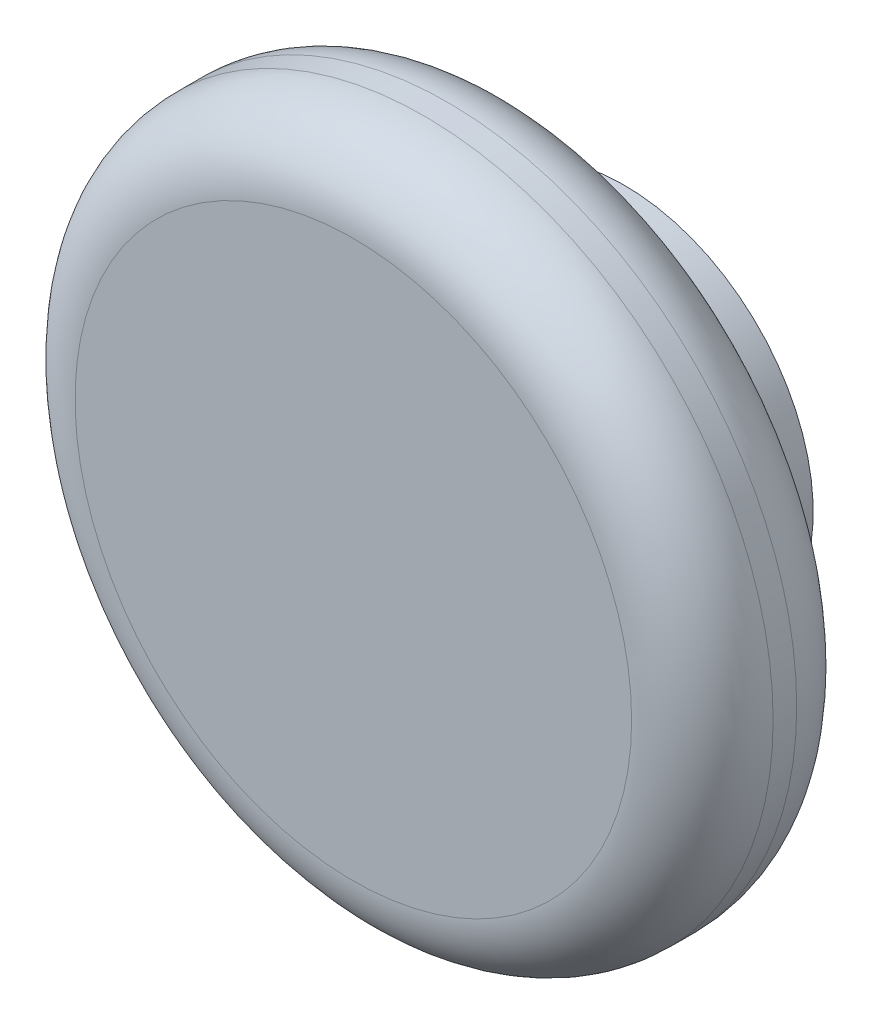
ISO-10303-21;
HEADER;
FILE_DESCRIPTION(('STEP AP214'),'2;1');
FILE_NAME('part.step','',(''),(''),'','','');
FILE_SCHEMA(('AUTOMOTIVE_DESIGN { 1 0 10303 214 1 1 1 1 }'));
ENDSEC;
DATA;
#1=APPLICATION_CONTEXT('core data for automotive mechanical design processes');
#2=APPLICATION_PROTOCOL_DEFINITION('international standard','automotive_design',2000,#1);
#3=PRODUCT_CONTEXT('',#1,'mechanical');
#4=PRODUCT('Part','Part','',(#3));
#5=PRODUCT_RELATED_PRODUCT_CATEGORY('part','',(#4));
#6=PRODUCT_DEFINITION_FORMATION('','',#4);
#7=PRODUCT_DEFINITION_CONTEXT('part definition',#1,'design');
#8=PRODUCT_DEFINITION('design','',#6,#7);
#9=PRODUCT_DEFINITION_SHAPE('','',#8);
#10=(LENGTH_UNIT() NAMED_UNIT(*) SI_UNIT(.MILLI.,.METRE.));
#11=(NAMED_UNIT(*) PLANE_ANGLE_UNIT() SI_UNIT($,.RADIAN.));
#12=(NAMED_UNIT(*) SI_UNIT($,.STERADIAN.) SOLID_ANGLE_UNIT());
#13=UNCERTAINTY_MEASURE_WITH_UNIT(LENGTH_MEASURE(1.E-05),#10,'distance_accuracy_value','');
#14=(GEOMETRIC_REPRESENTATION_CONTEXT(3) GLOBAL_UNCERTAINTY_ASSIGNED_CONTEXT((#13)) GLOBAL_UNIT_ASSIGNED_CONTEXT((#10,
#11,#12)) REPRESENTATION_CONTEXT('',''));
#15=CARTESIAN_POINT('',(0.,0.,0.));
#16=DIRECTION('',(0.,0.,1.));
#17=DIRECTION('',(1.,0.,0.));
#18=AXIS2_PLACEMENT_3D('',#15,#16,#17);
#19=CARTESIAN_POINT('',(-48.8951867843861,18.7018456364242,3.5));
#20=DIRECTION('',(0.,0.,-1.));
#21=DIRECTION('',(-1.,0.,0.));
#22=AXIS2_PLACEMENT_3D('',#19,#20,#21);
#23=CYLINDRICAL_SURFACE('',#22,7.4);
#24=CARTESIAN_POINT('',(-48.8951867843861,18.7018456364242,1.5));
#25=DIRECTION('',(0.,0.,1.));
#26=DIRECTION('',(1.,0.,0.));
#27=AXIS2_PLACEMENT_3D('',#24,#25,#26);
#28=CIRCLE('',#27,7.4);
#29=CARTESIAN_POINT('',(-41.4951867843861,18.7018456364242,1.5));
#30=VERTEX_POINT('',#29);
#31=EDGE_CURVE('E45',#30,#30,#28,.T.);
#32=ORIENTED_EDGE('',*,*,#31,.T.);
#33=EDGE_LOOP('',(#32));
#34=FACE_BOUND('',#33,.T.);
#35=CARTESIAN_POINT('',(-48.8951867843861,18.7018456364242,2.));
#36=DIRECTION('',(0.,0.,1.));
#37=DIRECTION('',(1.,0.,0.));
#38=AXIS2_PLACEMENT_3D('',#35,#36,#37);
#39=CIRCLE('',#38,7.4);
#40=CARTESIAN_POINT('',(-41.4951867843861,18.7018456364242,2.));
#41=VERTEX_POINT('',#40);
#42=EDGE_CURVE('E50',#41,#41,#39,.F.);
#43=ORIENTED_EDGE('',*,*,#42,.T.);
#44=EDGE_LOOP('',(#43));
#45=FACE_BOUND('',#44,.T.);
#46=ADVANCED_FACE('F37',(#34,#45),#23,.T.);
#47=CARTESIAN_POINT('',(-48.8951867843861,18.7018456364242,3.5));
#48=DIRECTION('',(0.,0.,1.));
#49=DIRECTION('',(1.,0.,0.));
#50=AXIS2_PLACEMENT_3D('',#47,#48,#49);
#51=PLANE('',#50);
#52=CARTESIAN_POINT('',(-48.8951867843861,18.7018456364242,3.5));
#53=DIRECTION('',(0.,0.,1.));
#54=DIRECTION('',(1.,0.,0.));
#55=AXIS2_PLACEMENT_3D('',#52,#53,#54);
#56=CIRCLE('',#55,5.9);
#57=CARTESIAN_POINT('',(-42.9951867843861,18.7018456364242,3.5));
#58=VERTEX_POINT('',#57);
#59=EDGE_CURVE('E55',#58,#58,#56,.T.);
#60=ORIENTED_EDGE('',*,*,#59,.T.);
#61=EDGE_LOOP('',(#60));
#62=FACE_BOUND('',#61,.T.);
#63=ADVANCED_FACE('F80',(#62),#51,.T.);
#64=CARTESIAN_POINT('',(-48.8951867843861,18.7018456364242,0.));
#65=DIRECTION('',(0.,0.,1.));
#66=DIRECTION('',(1.,0.,0.));
#67=AXIS2_PLACEMENT_3D('',#64,#65,#66);
#68=PLANE('',#67);
#69=CARTESIAN_POINT('',(-48.8951867843861,18.7018456364242,0.));
#70=DIRECTION('',(0.,0.,1.));
#71=DIRECTION('',(1.,0.,0.));
#72=AXIS2_PLACEMENT_3D('',#69,#70,#71);
#73=CIRCLE('',#72,5.9);
#74=CARTESIAN_POINT('',(-42.9951867843861,18.7018456364242,0.));
#75=VERTEX_POINT('',#74);
#76=EDGE_CURVE('E10',#75,#75,#73,.F.);
#77=ORIENTED_EDGE('',*,*,#76,.T.);
#78=EDGE_LOOP('',(#77));
#79=FACE_BOUND('',#78,.T.);
#80=CARTESIAN_POINT('',(-48.8951867843861,18.7018456364242,0.));
#81=DIRECTION('',(0.,0.,-1.));
#82=DIRECTION('',(-1.,0.,0.));
#83=AXIS2_PLACEMENT_3D('',#80,#81,#82);
#84=CIRCLE('',#83,4.00000000000001);
#85=CARTESIAN_POINT('',(-52.8951867843861,18.7018456364242,0.));
#86=VERTEX_POINT('',#85);
#87=EDGE_CURVE('E61',#86,#86,#84,.T.);
#88=ORIENTED_EDGE('',*,*,#87,.F.);
#89=EDGE_LOOP('',(#88));
#90=FACE_BOUND('',#89,.T.);
#91=ADVANCED_FACE('F75',(#79,#90),#68,.F.);
#92=CARTESIAN_POINT('',(-48.8951867843861,18.7018456364242,-2.25));
#93=DIRECTION('',(0.,0.,1.));
#94=DIRECTION('',(1.,0.,0.));
#95=AXIS2_PLACEMENT_3D('',#92,#93,#94);
#96=CYLINDRICAL_SURFACE('',#95,4.00000000000001);
#97=CARTESIAN_POINT('',(-48.8951867843861,18.7018456364242,-2.25));
#98=DIRECTION('',(0.,0.,-1.));
#99=DIRECTION('',(-1.,0.,0.));
#100=AXIS2_PLACEMENT_3D('',#97,#98,#99);
#101=CIRCLE('',#100,4.00000000000001);
#102=CARTESIAN_POINT('',(-52.8951867843861,18.7018456364242,-2.25));
#103=VERTEX_POINT('',#102);
#104=EDGE_CURVE('E65',#103,#103,#101,.T.);
#105=ORIENTED_EDGE('',*,*,#104,.F.);
#106=EDGE_LOOP('',(#105));
#107=FACE_BOUND('',#106,.T.);
#108=ORIENTED_EDGE('',*,*,#87,.T.);
#109=EDGE_LOOP('',(#108));
#110=FACE_BOUND('',#109,.T.);
#111=ADVANCED_FACE('F72',(#107,#110),#96,.T.);
#112=CARTESIAN_POINT('',(-48.8951867843861,18.7018456364242,-2.25));
#113=DIRECTION('',(0.,0.,-1.));
#114=DIRECTION('',(-1.,0.,0.));
#115=AXIS2_PLACEMENT_3D('',#112,#113,#114);
#116=PLANE('',#115);
#117=ORIENTED_EDGE('',*,*,#104,.T.);
#118=EDGE_LOOP('',(#117));
#119=FACE_BOUND('',#118,.T.);
#120=ADVANCED_FACE('F70',(#119),#116,.T.);
#121=CARTESIAN_POINT('',(-48.8951867843861,18.7018456364242,2.));
#122=DIRECTION('',(0.,0.,1.));
#123=DIRECTION('',(1.,0.,0.));
#124=AXIS2_PLACEMENT_3D('',#121,#122,#123);
#125=TOROIDAL_SURFACE('',#124,5.9,1.5);
#126=ORIENTED_EDGE('',*,*,#42,.F.);
#127=EDGE_LOOP('',(#126));
#128=FACE_BOUND('',#127,.T.);
#129=ORIENTED_EDGE('',*,*,#59,.F.);
#130=EDGE_LOOP('',(#129));
#131=FACE_BOUND('',#130,.T.);
#132=ADVANCED_FACE('F92',(#128,#131),#125,.T.);
#133=CARTESIAN_POINT('',(-48.8951867843861,18.7018456364242,1.5));
#134=DIRECTION('',(0.,0.,1.));
#135=DIRECTION('',(1.,0.,0.));
#136=AXIS2_PLACEMENT_3D('',#133,#134,#135);
#137=TOROIDAL_SURFACE('',#136,5.9,1.5);
#138=ORIENTED_EDGE('',*,*,#76,.F.);
#139=EDGE_LOOP('',(#138));
#140=FACE_BOUND('',#139,.T.);
#141=ORIENTED_EDGE('',*,*,#31,.F.);
#142=EDGE_LOOP('',(#141));
#143=FACE_BOUND('',#142,.T.);
#144=ADVANCED_FACE('F39',(#140,#143),#137,.T.);
#145=CLOSED_SHELL('',(#46,#63,#91,#111,#120,#132,#144));
#146=MANIFOLD_SOLID_BREP('B2',#145);
#147=ADVANCED_BREP_SHAPE_REPRESENTATION('',(#18,#146),#14);
#148=SHAPE_DEFINITION_REPRESENTATION(#9,#147);
ENDSEC;
END-ISO-10303-21;
